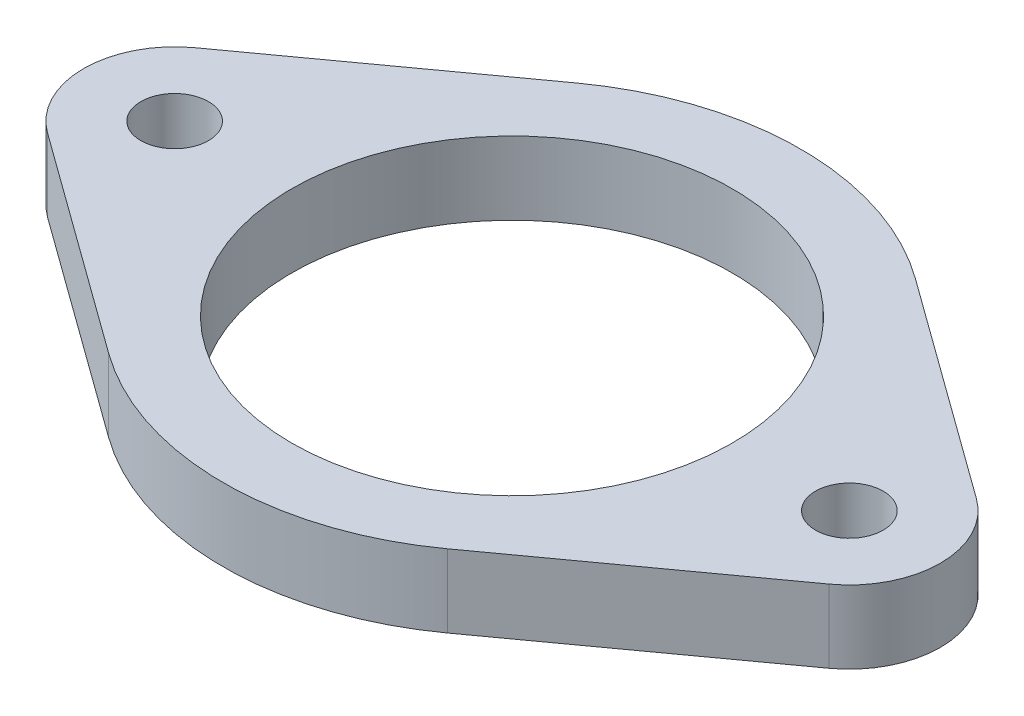
ISO-10303-21;
HEADER;
FILE_DESCRIPTION(('STEP AP214'),'2;1');
FILE_NAME('part.step','',(''),(''),'','','');
FILE_SCHEMA(('AUTOMOTIVE_DESIGN { 1 0 10303 214 1 1 1 1 }'));
ENDSEC;
DATA;
#1=APPLICATION_CONTEXT('core data for automotive mechanical design processes');
#2=APPLICATION_PROTOCOL_DEFINITION('international standard','automotive_design',2000,#1);
#3=PRODUCT_CONTEXT('',#1,'mechanical');
#4=PRODUCT('Part','Part','',(#3));
#5=PRODUCT_RELATED_PRODUCT_CATEGORY('part','',(#4));
#6=PRODUCT_DEFINITION_FORMATION('','',#4);
#7=PRODUCT_DEFINITION_CONTEXT('part definition',#1,'design');
#8=PRODUCT_DEFINITION('design','',#6,#7);
#9=PRODUCT_DEFINITION_SHAPE('','',#8);
#10=(LENGTH_UNIT() NAMED_UNIT(*) SI_UNIT(.MILLI.,.METRE.));
#11=(NAMED_UNIT(*) PLANE_ANGLE_UNIT() SI_UNIT($,.RADIAN.));
#12=(NAMED_UNIT(*) SI_UNIT($,.STERADIAN.) SOLID_ANGLE_UNIT());
#13=UNCERTAINTY_MEASURE_WITH_UNIT(LENGTH_MEASURE(1.E-05),#10,'distance_accuracy_value','');
#14=(GEOMETRIC_REPRESENTATION_CONTEXT(3) GLOBAL_UNCERTAINTY_ASSIGNED_CONTEXT((#13)) GLOBAL_UNIT_ASSIGNED_CONTEXT((#10,
#11,#12)) REPRESENTATION_CONTEXT('',''));
#15=CARTESIAN_POINT('',(0.,0.,0.));
#16=DIRECTION('',(0.,0.,1.));
#17=DIRECTION('',(1.,0.,0.));
#18=AXIS2_PLACEMENT_3D('',#15,#16,#17);
#19=CARTESIAN_POINT('',(0.,3.175,0.00242516752207305));
#20=DIRECTION('',(0.,-1.,0.));
#21=DIRECTION('',(0.,0.,-1.));
#22=AXIS2_PLACEMENT_3D('',#19,#20,#21);
#23=PLANE('',#22);
#24=CARTESIAN_POINT('',(0.,3.175,0.00242516752207305));
#25=DIRECTION('',(0.,1.,0.));
#26=DIRECTION('',(0.,0.,-1.));
#27=AXIS2_PLACEMENT_3D('',#24,#25,#26);
#28=CIRCLE('',#27,12.573);
#29=CARTESIAN_POINT('',(7.37282299076822,3.175,-10.1819653467306));
#30=VERTEX_POINT('',#29);
#31=CARTESIAN_POINT('',(-7.37282299076822,3.175,-10.1819653467306));
#32=VERTEX_POINT('',#31);
#33=EDGE_CURVE('E147',#30,#32,#28,.T.);
#34=ORIENTED_EDGE('',*,*,#33,.T.);
#35=DIRECTION('',(-0.810020720134627,0.,0.586401255926844));
#36=VECTOR('',#35,1.);
#37=CARTESIAN_POINT('',(-17.0040084621384,3.175,-3.20962610146145));
#38=LINE('',#37,#36);
#39=CARTESIAN_POINT('',(-17.0040084621384,3.175,-3.20962610146144));
#40=VERTEX_POINT('',#39);
#41=EDGE_CURVE('E95',#32,#40,#38,.T.);
#42=ORIENTED_EDGE('',*,*,#41,.T.);
#43=CARTESIAN_POINT('',(-14.6804521256538,3.175,0.));
#44=DIRECTION('',(0.,1.,0.));
#45=DIRECTION('',(0.,0.,1.));
#46=AXIS2_PLACEMENT_3D('',#43,#44,#45);
#47=CIRCLE('',#46,3.9624);
#48=CARTESIAN_POINT('',(-17.0040084621384,3.175,3.20962610146144));
#49=VERTEX_POINT('',#48);
#50=EDGE_CURVE('E162',#40,#49,#47,.T.);
#51=ORIENTED_EDGE('',*,*,#50,.T.);
#52=DIRECTION('',(0.810020720134626,0.,0.586401255926845));
#53=VECTOR('',#52,1.);
#54=CARTESIAN_POINT('',(-17.0040084621384,3.175,3.20962610146144));
#55=LINE('',#54,#53);
#56=CARTESIAN_POINT('',(-7.37282299076822,3.175,10.1819653467306));
#57=VERTEX_POINT('',#56);
#58=EDGE_CURVE('E175',#49,#57,#55,.T.);
#59=ORIENTED_EDGE('',*,*,#58,.T.);
#60=CARTESIAN_POINT('',(0.,3.175,-0.00242516752207078));
#61=DIRECTION('',(0.,1.,0.));
#62=DIRECTION('',(0.,0.,1.));
#63=AXIS2_PLACEMENT_3D('',#60,#61,#62);
#64=CIRCLE('',#63,12.573);
#65=CARTESIAN_POINT('',(7.37282299076821,3.175,10.1819653467306));
#66=VERTEX_POINT('',#65);
#67=EDGE_CURVE('E114',#57,#66,#64,.T.);
#68=ORIENTED_EDGE('',*,*,#67,.T.);
#69=DIRECTION('',(0.810020720134627,0.,-0.586401255926844));
#70=VECTOR('',#69,1.);
#71=CARTESIAN_POINT('',(7.37282299076821,3.175,10.1819653467306));
#72=LINE('',#71,#70);
#73=CARTESIAN_POINT('',(17.0040084621384,3.175,3.20962610146144));
#74=VERTEX_POINT('',#73);
#75=EDGE_CURVE('E108',#66,#74,#72,.T.);
#76=ORIENTED_EDGE('',*,*,#75,.T.);
#77=CARTESIAN_POINT('',(14.6804521256538,3.175,0.));
#78=DIRECTION('',(0.,1.,0.));
#79=DIRECTION('',(0.,0.,-1.));
#80=AXIS2_PLACEMENT_3D('',#77,#78,#79);
#81=CIRCLE('',#80,3.9624);
#82=CARTESIAN_POINT('',(17.0040084621384,3.175,-3.20962610146145));
#83=VERTEX_POINT('',#82);
#84=EDGE_CURVE('E112',#74,#83,#81,.T.);
#85=ORIENTED_EDGE('',*,*,#84,.T.);
#86=DIRECTION('',(-0.810020720134627,0.,-0.586401255926845));
#87=VECTOR('',#86,1.);
#88=CARTESIAN_POINT('',(7.37282299076822,3.175,-10.1819653467306));
#89=LINE('',#88,#87);
#90=EDGE_CURVE('E52',#83,#30,#89,.T.);
#91=ORIENTED_EDGE('',*,*,#90,.T.);
#92=EDGE_LOOP('',(#34,#42,#51,#59,#68,#76,#85,#91));
#93=FACE_BOUND('',#92,.T.);
#94=CARTESIAN_POINT('',(0.,3.175,0.));
#95=DIRECTION('',(0.,1.,0.));
#96=DIRECTION('',(0.,0.,1.));
#97=AXIS2_PLACEMENT_3D('',#94,#95,#96);
#98=CIRCLE('',#97,9.5885);
#99=CARTESIAN_POINT('',(0.,3.175,9.5885));
#100=VERTEX_POINT('',#99);
#101=EDGE_CURVE('E136',#100,#100,#98,.T.);
#102=ORIENTED_EDGE('',*,*,#101,.F.);
#103=EDGE_LOOP('',(#102));
#104=FACE_BOUND('',#103,.T.);
#105=CARTESIAN_POINT('',(14.6812,3.175,0.));
#106=DIRECTION('',(0.,1.,0.));
#107=DIRECTION('',(0.,0.,1.));
#108=AXIS2_PLACEMENT_3D('',#105,#106,#107);
#109=CIRCLE('',#108,1.4732);
#110=CARTESIAN_POINT('',(14.6812,3.175,1.4732));
#111=VERTEX_POINT('',#110);
#112=EDGE_CURVE('E184',#111,#111,#109,.T.);
#113=ORIENTED_EDGE('',*,*,#112,.F.);
#114=EDGE_LOOP('',(#113));
#115=FACE_BOUND('',#114,.T.);
#116=CARTESIAN_POINT('',(-14.6812,3.175,0.));
#117=DIRECTION('',(0.,1.,0.));
#118=DIRECTION('',(0.,0.,1.));
#119=AXIS2_PLACEMENT_3D('',#116,#117,#118);
#120=CIRCLE('',#119,1.4732);
#121=CARTESIAN_POINT('',(-14.6812,3.175,1.4732));
#122=VERTEX_POINT('',#121);
#123=EDGE_CURVE('E190',#122,#122,#120,.T.);
#124=ORIENTED_EDGE('',*,*,#123,.F.);
#125=EDGE_LOOP('',(#124));
#126=FACE_BOUND('',#125,.T.);
#127=ADVANCED_FACE('F35',(#93,#104,#115,#126),#23,.F.);
#128=CARTESIAN_POINT('',(0.,0.,0.00242516752207305));
#129=DIRECTION('',(0.,-1.,0.));
#130=DIRECTION('',(0.,0.,-1.));
#131=AXIS2_PLACEMENT_3D('',#128,#129,#130);
#132=PLANE('',#131);
#133=CARTESIAN_POINT('',(14.6812,0.,0.));
#134=DIRECTION('',(0.,1.,0.));
#135=DIRECTION('',(0.,0.,1.));
#136=AXIS2_PLACEMENT_3D('',#133,#134,#135);
#137=CIRCLE('',#136,1.4732);
#138=CARTESIAN_POINT('',(14.6812,0.,1.4732));
#139=VERTEX_POINT('',#138);
#140=EDGE_CURVE('E187',#139,#139,#137,.T.);
#141=ORIENTED_EDGE('',*,*,#140,.T.);
#142=EDGE_LOOP('',(#141));
#143=FACE_BOUND('',#142,.T.);
#144=CARTESIAN_POINT('',(0.,0.,0.00242516752207305));
#145=DIRECTION('',(0.,1.,0.));
#146=DIRECTION('',(0.,0.,-1.));
#147=AXIS2_PLACEMENT_3D('',#144,#145,#146);
#148=CIRCLE('',#147,12.573);
#149=CARTESIAN_POINT('',(7.37282299076822,0.,-10.1819653467306));
#150=VERTEX_POINT('',#149);
#151=CARTESIAN_POINT('',(-7.37282299076822,0.,-10.1819653467306));
#152=VERTEX_POINT('',#151);
#153=EDGE_CURVE('E132',#150,#152,#148,.T.);
#154=ORIENTED_EDGE('',*,*,#153,.F.);
#155=DIRECTION('',(-0.810020720134627,0.,-0.586401255926845));
#156=VECTOR('',#155,1.);
#157=CARTESIAN_POINT('',(7.37282299076822,0.,-10.1819653467306));
#158=LINE('',#157,#156);
#159=CARTESIAN_POINT('',(17.0040084621384,0.,-3.20962610146145));
#160=VERTEX_POINT('',#159);
#161=EDGE_CURVE('E87',#160,#150,#158,.T.);
#162=ORIENTED_EDGE('',*,*,#161,.F.);
#163=CARTESIAN_POINT('',(14.6804521256538,0.,0.));
#164=DIRECTION('',(0.,1.,0.));
#165=DIRECTION('',(0.,0.,-1.));
#166=AXIS2_PLACEMENT_3D('',#163,#164,#165);
#167=CIRCLE('',#166,3.9624);
#168=CARTESIAN_POINT('',(17.0040084621384,0.,3.20962610146144));
#169=VERTEX_POINT('',#168);
#170=EDGE_CURVE('E81',#169,#160,#167,.T.);
#171=ORIENTED_EDGE('',*,*,#170,.F.);
#172=DIRECTION('',(0.810020720134627,0.,-0.586401255926844));
#173=VECTOR('',#172,1.);
#174=CARTESIAN_POINT('',(7.37282299076821,0.,10.1819653467306));
#175=LINE('',#174,#173);
#176=CARTESIAN_POINT('',(7.37282299076821,0.,10.1819653467306));
#177=VERTEX_POINT('',#176);
#178=EDGE_CURVE('E122',#177,#169,#175,.T.);
#179=ORIENTED_EDGE('',*,*,#178,.F.);
#180=CARTESIAN_POINT('',(0.,0.,-0.00242516752207078));
#181=DIRECTION('',(0.,1.,0.));
#182=DIRECTION('',(0.,0.,1.));
#183=AXIS2_PLACEMENT_3D('',#180,#181,#182);
#184=CIRCLE('',#183,12.573);
#185=CARTESIAN_POINT('',(-7.37282299076822,0.,10.1819653467306));
#186=VERTEX_POINT('',#185);
#187=EDGE_CURVE('E142',#186,#177,#184,.T.);
#188=ORIENTED_EDGE('',*,*,#187,.F.);
#189=DIRECTION('',(0.810020720134626,0.,0.586401255926845));
#190=VECTOR('',#189,1.);
#191=CARTESIAN_POINT('',(-17.0040084621384,0.,3.20962610146144));
#192=LINE('',#191,#190);
#193=CARTESIAN_POINT('',(-17.0040084621384,0.,3.20962610146144));
#194=VERTEX_POINT('',#193);
#195=EDGE_CURVE('E140',#194,#186,#192,.T.);
#196=ORIENTED_EDGE('',*,*,#195,.F.);
#197=CARTESIAN_POINT('',(-14.6804521256538,0.,0.));
#198=DIRECTION('',(0.,1.,0.));
#199=DIRECTION('',(0.,0.,1.));
#200=AXIS2_PLACEMENT_3D('',#197,#198,#199);
#201=CIRCLE('',#200,3.9624);
#202=CARTESIAN_POINT('',(-17.0040084621384,0.,-3.20962610146144));
#203=VERTEX_POINT('',#202);
#204=EDGE_CURVE('E138',#203,#194,#201,.T.);
#205=ORIENTED_EDGE('',*,*,#204,.F.);
#206=DIRECTION('',(-0.810020720134627,0.,0.586401255926844));
#207=VECTOR('',#206,1.);
#208=CARTESIAN_POINT('',(-17.0040084621384,0.,-3.20962610146145));
#209=LINE('',#208,#207);
#210=EDGE_CURVE('E135',#152,#203,#209,.T.);
#211=ORIENTED_EDGE('',*,*,#210,.F.);
#212=EDGE_LOOP('',(#154,#162,#171,#179,#188,#196,#205,#211));
#213=FACE_BOUND('',#212,.T.);
#214=CARTESIAN_POINT('',(0.,0.,0.));
#215=DIRECTION('',(0.,1.,0.));
#216=DIRECTION('',(0.,0.,1.));
#217=AXIS2_PLACEMENT_3D('',#214,#215,#216);
#218=CIRCLE('',#217,9.5885);
#219=CARTESIAN_POINT('',(0.,0.,9.5885));
#220=VERTEX_POINT('',#219);
#221=EDGE_CURVE('E181',#220,#220,#218,.T.);
#222=ORIENTED_EDGE('',*,*,#221,.T.);
#223=EDGE_LOOP('',(#222));
#224=FACE_BOUND('',#223,.T.);
#225=CARTESIAN_POINT('',(-14.6812,0.,0.));
#226=DIRECTION('',(0.,1.,0.));
#227=DIRECTION('',(0.,0.,1.));
#228=AXIS2_PLACEMENT_3D('',#225,#226,#227);
#229=CIRCLE('',#228,1.4732);
#230=CARTESIAN_POINT('',(-14.6812,0.,1.4732));
#231=VERTEX_POINT('',#230);
#232=EDGE_CURVE('E193',#231,#231,#229,.T.);
#233=ORIENTED_EDGE('',*,*,#232,.T.);
#234=EDGE_LOOP('',(#233));
#235=FACE_BOUND('',#234,.T.);
#236=ADVANCED_FACE('F166',(#143,#213,#224,#235),#132,.T.);
#237=CARTESIAN_POINT('',(0.,3.175,0.00242516752207305));
#238=DIRECTION('',(0.,-1.,0.));
#239=DIRECTION('',(0.,0.,-1.));
#240=AXIS2_PLACEMENT_3D('',#237,#238,#239);
#241=CYLINDRICAL_SURFACE('',#240,12.573);
#242=ORIENTED_EDGE('',*,*,#153,.T.);
#243=DIRECTION('',(0.,-1.,0.));
#244=VECTOR('',#243,1.);
#245=CARTESIAN_POINT('',(-7.37282299076822,3.175,-10.1819653467306));
#246=LINE('',#245,#244);
#247=EDGE_CURVE('E11',#32,#152,#246,.T.);
#248=ORIENTED_EDGE('',*,*,#247,.F.);
#249=ORIENTED_EDGE('',*,*,#33,.F.);
#250=DIRECTION('',(0.,-1.,0.));
#251=VECTOR('',#250,1.);
#252=CARTESIAN_POINT('',(7.37282299076822,3.175,-10.1819653467306));
#253=LINE('',#252,#251);
#254=EDGE_CURVE('E128',#30,#150,#253,.T.);
#255=ORIENTED_EDGE('',*,*,#254,.T.);
#256=EDGE_LOOP('',(#242,#248,#249,#255));
#257=FACE_BOUND('',#256,.T.);
#258=ADVANCED_FACE('F37',(#257),#241,.T.);
#259=CARTESIAN_POINT('',(-17.0040084621384,3.175,-3.20962610146145));
#260=DIRECTION('',(0.586401255926844,0.,0.810020720134627));
#261=DIRECTION('',(0.810020720134627,0.,-0.586401255926844));
#262=AXIS2_PLACEMENT_3D('',#259,#260,#261);
#263=PLANE('',#262);
#264=ORIENTED_EDGE('',*,*,#210,.T.);
#265=DIRECTION('',(0.,-1.,0.));
#266=VECTOR('',#265,1.);
#267=CARTESIAN_POINT('',(-17.0040084621384,3.175,-3.20962610146144));
#268=LINE('',#267,#266);
#269=EDGE_CURVE('E44',#40,#203,#268,.T.);
#270=ORIENTED_EDGE('',*,*,#269,.F.);
#271=ORIENTED_EDGE('',*,*,#41,.F.);
#272=ORIENTED_EDGE('',*,*,#247,.T.);
#273=EDGE_LOOP('',(#264,#270,#271,#272));
#274=FACE_BOUND('',#273,.T.);
#275=ADVANCED_FACE('F225',(#274),#263,.F.);
#276=CARTESIAN_POINT('',(-14.6804521256538,3.175,0.));
#277=DIRECTION('',(0.,-1.,0.));
#278=DIRECTION('',(0.,0.,-1.));
#279=AXIS2_PLACEMENT_3D('',#276,#277,#278);
#280=CYLINDRICAL_SURFACE('',#279,3.9624);
#281=ORIENTED_EDGE('',*,*,#204,.T.);
#282=DIRECTION('',(0.,-1.,0.));
#283=VECTOR('',#282,1.);
#284=CARTESIAN_POINT('',(-17.0040084621384,3.175,3.20962610146144));
#285=LINE('',#284,#283);
#286=EDGE_CURVE('E154',#49,#194,#285,.T.);
#287=ORIENTED_EDGE('',*,*,#286,.F.);
#288=ORIENTED_EDGE('',*,*,#50,.F.);
#289=ORIENTED_EDGE('',*,*,#269,.T.);
#290=EDGE_LOOP('',(#281,#287,#288,#289));
#291=FACE_BOUND('',#290,.T.);
#292=ADVANCED_FACE('F160',(#291),#280,.T.);
#293=CARTESIAN_POINT('',(-17.0040084621384,3.175,3.20962610146144));
#294=DIRECTION('',(0.586401255926845,0.,-0.810020720134626));
#295=DIRECTION('',(-0.810020720134626,0.,-0.586401255926845));
#296=AXIS2_PLACEMENT_3D('',#293,#294,#295);
#297=PLANE('',#296);
#298=ORIENTED_EDGE('',*,*,#195,.T.);
#299=DIRECTION('',(0.,-1.,0.));
#300=VECTOR('',#299,1.);
#301=CARTESIAN_POINT('',(-7.37282299076822,3.175,10.1819653467306));
#302=LINE('',#301,#300);
#303=EDGE_CURVE('E151',#57,#186,#302,.T.);
#304=ORIENTED_EDGE('',*,*,#303,.F.);
#305=ORIENTED_EDGE('',*,*,#58,.F.);
#306=ORIENTED_EDGE('',*,*,#286,.T.);
#307=EDGE_LOOP('',(#298,#304,#305,#306));
#308=FACE_BOUND('',#307,.T.);
#309=ADVANCED_FACE('F171',(#308),#297,.F.);
#310=CARTESIAN_POINT('',(0.,3.175,-0.00242516752207078));
#311=DIRECTION('',(0.,-1.,0.));
#312=DIRECTION('',(0.,0.,-1.));
#313=AXIS2_PLACEMENT_3D('',#310,#311,#312);
#314=CYLINDRICAL_SURFACE('',#313,12.573);
#315=ORIENTED_EDGE('',*,*,#187,.T.);
#316=DIRECTION('',(0.,-1.,0.));
#317=VECTOR('',#316,1.);
#318=CARTESIAN_POINT('',(7.37282299076821,3.175,10.1819653467306));
#319=LINE('',#318,#317);
#320=EDGE_CURVE('E123',#66,#177,#319,.T.);
#321=ORIENTED_EDGE('',*,*,#320,.F.);
#322=ORIENTED_EDGE('',*,*,#67,.F.);
#323=ORIENTED_EDGE('',*,*,#303,.T.);
#324=EDGE_LOOP('',(#315,#321,#322,#323));
#325=FACE_BOUND('',#324,.T.);
#326=ADVANCED_FACE('F174',(#325),#314,.T.);
#327=CARTESIAN_POINT('',(7.37282299076821,3.175,10.1819653467306));
#328=DIRECTION('',(-0.586401255926844,0.,-0.810020720134627));
#329=DIRECTION('',(-0.810020720134627,0.,0.586401255926844));
#330=AXIS2_PLACEMENT_3D('',#327,#328,#329);
#331=PLANE('',#330);
#332=ORIENTED_EDGE('',*,*,#178,.T.);
#333=DIRECTION('',(0.,-1.,0.));
#334=VECTOR('',#333,1.);
#335=CARTESIAN_POINT('',(17.0040084621384,3.175,3.20962610146144));
#336=LINE('',#335,#334);
#337=EDGE_CURVE('E119',#74,#169,#336,.T.);
#338=ORIENTED_EDGE('',*,*,#337,.F.);
#339=ORIENTED_EDGE('',*,*,#75,.F.);
#340=ORIENTED_EDGE('',*,*,#320,.T.);
#341=EDGE_LOOP('',(#332,#338,#339,#340));
#342=FACE_BOUND('',#341,.T.);
#343=ADVANCED_FACE('F120',(#342),#331,.F.);
#344=CARTESIAN_POINT('',(14.6804521256538,3.175,0.));
#345=DIRECTION('',(0.,-1.,0.));
#346=DIRECTION('',(0.,0.,-1.));
#347=AXIS2_PLACEMENT_3D('',#344,#345,#346);
#348=CYLINDRICAL_SURFACE('',#347,3.9624);
#349=ORIENTED_EDGE('',*,*,#170,.T.);
#350=DIRECTION('',(0.,-1.,0.));
#351=VECTOR('',#350,1.);
#352=CARTESIAN_POINT('',(17.0040084621384,3.175,-3.20962610146145));
#353=LINE('',#352,#351);
#354=EDGE_CURVE('E124',#83,#160,#353,.T.);
#355=ORIENTED_EDGE('',*,*,#354,.F.);
#356=ORIENTED_EDGE('',*,*,#84,.F.);
#357=ORIENTED_EDGE('',*,*,#337,.T.);
#358=EDGE_LOOP('',(#349,#355,#356,#357));
#359=FACE_BOUND('',#358,.T.);
#360=ADVANCED_FACE('F126',(#359),#348,.T.);
#361=CARTESIAN_POINT('',(7.37282299076822,3.175,-10.1819653467306));
#362=DIRECTION('',(-0.586401255926845,0.,0.810020720134627));
#363=DIRECTION('',(0.810020720134627,0.,0.586401255926845));
#364=AXIS2_PLACEMENT_3D('',#361,#362,#363);
#365=PLANE('',#364);
#366=ORIENTED_EDGE('',*,*,#161,.T.);
#367=ORIENTED_EDGE('',*,*,#254,.F.);
#368=ORIENTED_EDGE('',*,*,#90,.F.);
#369=ORIENTED_EDGE('',*,*,#354,.T.);
#370=EDGE_LOOP('',(#366,#367,#368,#369));
#371=FACE_BOUND('',#370,.T.);
#372=ADVANCED_FACE('F213',(#371),#365,.F.);
#373=CARTESIAN_POINT('',(0.,3.175,0.));
#374=DIRECTION('',(0.,-1.,0.));
#375=DIRECTION('',(0.,0.,-1.));
#376=AXIS2_PLACEMENT_3D('',#373,#374,#375);
#377=CYLINDRICAL_SURFACE('',#376,9.5885);
#378=ORIENTED_EDGE('',*,*,#101,.T.);
#379=EDGE_LOOP('',(#378));
#380=FACE_BOUND('',#379,.T.);
#381=ORIENTED_EDGE('',*,*,#221,.F.);
#382=EDGE_LOOP('',(#381));
#383=FACE_BOUND('',#382,.T.);
#384=ADVANCED_FACE('F210',(#380,#383),#377,.F.);
#385=CARTESIAN_POINT('',(14.6812,3.175,0.));
#386=DIRECTION('',(0.,-1.,0.));
#387=DIRECTION('',(0.,0.,-1.));
#388=AXIS2_PLACEMENT_3D('',#385,#386,#387);
#389=CYLINDRICAL_SURFACE('',#388,1.4732);
#390=ORIENTED_EDGE('',*,*,#112,.T.);
#391=EDGE_LOOP('',(#390));
#392=FACE_BOUND('',#391,.T.);
#393=ORIENTED_EDGE('',*,*,#140,.F.);
#394=EDGE_LOOP('',(#393));
#395=FACE_BOUND('',#394,.T.);
#396=ADVANCED_FACE('F289',(#392,#395),#389,.F.);
#397=CARTESIAN_POINT('',(-14.6812,3.175,0.));
#398=DIRECTION('',(0.,-1.,0.));
#399=DIRECTION('',(0.,0.,-1.));
#400=AXIS2_PLACEMENT_3D('',#397,#398,#399);
#401=CYLINDRICAL_SURFACE('',#400,1.4732);
#402=ORIENTED_EDGE('',*,*,#123,.T.);
#403=EDGE_LOOP('',(#402));
#404=FACE_BOUND('',#403,.T.);
#405=ORIENTED_EDGE('',*,*,#232,.F.);
#406=EDGE_LOOP('',(#405));
#407=FACE_BOUND('',#406,.T.);
#408=ADVANCED_FACE('F199',(#404,#407),#401,.F.);
#409=CLOSED_SHELL('',(#127,#236,#258,#275,#292,#309,#326,#343,#360,#372,#384,#396,#408));
#410=MANIFOLD_SOLID_BREP('B2',#409);
#411=ADVANCED_BREP_SHAPE_REPRESENTATION('',(#18,#410),#14);
#412=SHAPE_DEFINITION_REPRESENTATION(#9,#411);
ENDSEC;
END-ISO-10303-21;
